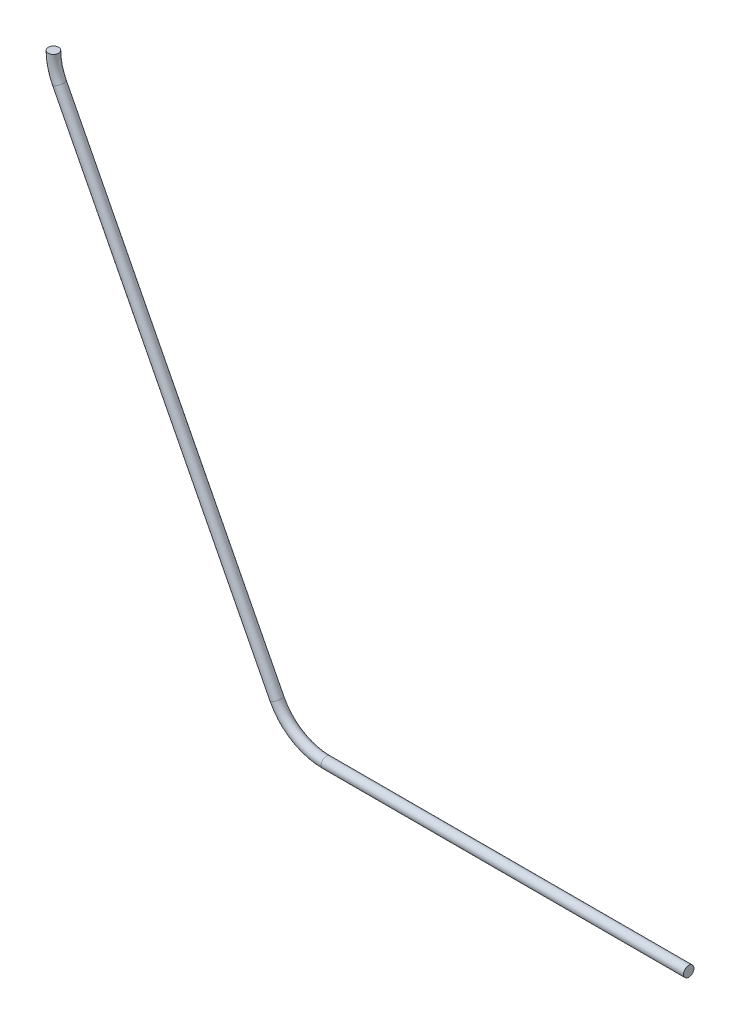
ISO-10303-21;
HEADER;
FILE_DESCRIPTION(('STEP AP214'),'2;1');
FILE_NAME('part.step','',(''),(''),'','','');
FILE_SCHEMA(('AUTOMOTIVE_DESIGN { 1 0 10303 214 1 1 1 1 }'));
ENDSEC;
DATA;
#1=APPLICATION_CONTEXT('core data for automotive mechanical design processes');
#2=APPLICATION_PROTOCOL_DEFINITION('international standard','automotive_design',2000,#1);
#3=PRODUCT_CONTEXT('',#1,'mechanical');
#4=PRODUCT('Part','Part','',(#3));
#5=PRODUCT_RELATED_PRODUCT_CATEGORY('part','',(#4));
#6=PRODUCT_DEFINITION_FORMATION('','',#4);
#7=PRODUCT_DEFINITION_CONTEXT('part definition',#1,'design');
#8=PRODUCT_DEFINITION('design','',#6,#7);
#9=PRODUCT_DEFINITION_SHAPE('','',#8);
#10=(LENGTH_UNIT() NAMED_UNIT(*) SI_UNIT(.MILLI.,.METRE.));
#11=(NAMED_UNIT(*) PLANE_ANGLE_UNIT() SI_UNIT($,.RADIAN.));
#12=(NAMED_UNIT(*) SI_UNIT($,.STERADIAN.) SOLID_ANGLE_UNIT());
#13=UNCERTAINTY_MEASURE_WITH_UNIT(LENGTH_MEASURE(1.E-05),#10,'distance_accuracy_value','');
#14=(GEOMETRIC_REPRESENTATION_CONTEXT(3) GLOBAL_UNCERTAINTY_ASSIGNED_CONTEXT((#13)) GLOBAL_UNIT_ASSIGNED_CONTEXT((#10,
#11,#12)) REPRESENTATION_CONTEXT('',''));
#15=CARTESIAN_POINT('',(0.,0.,0.));
#16=DIRECTION('',(0.,0.,1.));
#17=DIRECTION('',(1.,0.,0.));
#18=AXIS2_PLACEMENT_3D('',#15,#16,#17);
#19=CARTESIAN_POINT('',(-5.36,0.,0.));
#20=DIRECTION('',(0.,1.,0.));
#21=DIRECTION('',(0.,0.,1.));
#22=AXIS2_PLACEMENT_3D('',#19,#20,#21);
#23=PLANE('',#22);
#24=CARTESIAN_POINT('',(-5.36,0.,0.));
#25=DIRECTION('',(0.,1.,0.));
#26=DIRECTION('',(0.,0.,1.));
#27=AXIS2_PLACEMENT_3D('',#24,#25,#26);
#28=CIRCLE('',#27,0.500000000000001);
#29=CARTESIAN_POINT('',(-5.36,0.,0.500000000000001));
#30=VERTEX_POINT('',#29);
#31=EDGE_CURVE('E48',#30,#30,#28,.T.);
#32=ORIENTED_EDGE('',*,*,#31,.T.);
#33=EDGE_LOOP('',(#32));
#34=FACE_BOUND('',#33,.T.);
#35=ADVANCED_FACE('F36',(#34),#23,.T.);
#36=CARTESIAN_POINT('',(56.,-46.36,0.));
#37=DIRECTION('',(-1.,0.,0.));
#38=DIRECTION('',(0.,0.,1.));
#39=AXIS2_PLACEMENT_3D('',#36,#37,#38);
#40=PLANE('',#39);
#41=CARTESIAN_POINT('',(56.,-46.36,0.));
#42=DIRECTION('',(-1.,0.,0.));
#43=DIRECTION('',(0.,0.,1.));
#44=AXIS2_PLACEMENT_3D('',#41,#42,#43);
#45=CIRCLE('',#44,0.500000000000001);
#46=CARTESIAN_POINT('',(56.,-46.36,0.500000000000001));
#47=VERTEX_POINT('',#46);
#48=EDGE_CURVE('E11',#47,#47,#45,.T.);
#49=ORIENTED_EDGE('',*,*,#48,.F.);
#50=EDGE_LOOP('',(#49));
#51=FACE_BOUND('',#50,.T.);
#52=ADVANCED_FACE('F54',(#51),#40,.F.);
#53=CARTESIAN_POINT('',(0.,0.,0.));
#54=DIRECTION('',(0.,0.,1.));
#55=DIRECTION('',(1.,0.,0.));
#56=AXIS2_PLACEMENT_3D('',#53,#54,#55);
#57=TOROIDAL_SURFACE('',#56,5.36,0.500000000000001);
#58=CARTESIAN_POINT('',(-4.77063243564244,-2.44349466215833,0.));
#59=DIRECTION('',(-0.455875869805658,0.890043364858665,0.));
#60=DIRECTION('',(0.,0.,1.));
#61=AXIS2_PLACEMENT_3D('',#58,#59,#60);
#62=CIRCLE('',#61,0.500000000000001);
#63=CARTESIAN_POINT('',(-4.77063243564244,-2.44349466215833,0.500000000000001));
#64=VERTEX_POINT('',#63);
#65=EDGE_CURVE('E84',#64,#64,#62,.T.);
#66=ORIENTED_EDGE('',*,*,#65,.T.);
#67=EDGE_LOOP('',(#66));
#68=FACE_BOUND('',#67,.T.);
#69=ORIENTED_EDGE('',*,*,#31,.F.);
#70=EDGE_LOOP('',(#69));
#71=FACE_BOUND('',#70,.T.);
#72=ADVANCED_FACE('F56',(#68,#71),#57,.T.);
#73=CARTESIAN_POINT('',(-4.77063243564244,-2.44349466215833,0.));
#74=DIRECTION('',(0.455875869805658,-0.890043364858665,0.));
#75=DIRECTION('',(0.890043364858665,0.455875869805658,0.));
#76=AXIS2_PLACEMENT_3D('',#73,#74,#75);
#77=CYLINDRICAL_SURFACE('',#76,0.500000000000001);
#78=CARTESIAN_POINT('',(16.2293675643576,-43.4434946621583,0.));
#79=DIRECTION('',(-0.455875869805658,0.890043364858665,0.));
#80=DIRECTION('',(0.,0.,1.));
#81=AXIS2_PLACEMENT_3D('',#78,#79,#80);
#82=CIRCLE('',#81,0.500000000000001);
#83=CARTESIAN_POINT('',(15.7843458819282,-43.6714325970611,0.));
#84=VERTEX_POINT('',#83);
#85=EDGE_CURVE('E81',#84,#84,#82,.T.);
#86=ORIENTED_EDGE('',*,*,#85,.T.);
#87=EDGE_LOOP('',(#86));
#88=FACE_BOUND('',#87,.T.);
#89=ORIENTED_EDGE('',*,*,#65,.F.);
#90=EDGE_LOOP('',(#89));
#91=FACE_BOUND('',#90,.T.);
#92=ADVANCED_FACE('F61',(#88,#91),#77,.T.);
#93=CARTESIAN_POINT('',(21.,-41.,0.));
#94=DIRECTION('',(0.,0.,1.));
#95=DIRECTION('',(1.,0.,0.));
#96=AXIS2_PLACEMENT_3D('',#93,#94,#95);
#97=TOROIDAL_SURFACE('',#96,5.36,0.500000000000001);
#98=CARTESIAN_POINT('',(21.,-46.36,0.));
#99=DIRECTION('',(-1.,0.,0.));
#100=DIRECTION('',(0.,0.,1.));
#101=AXIS2_PLACEMENT_3D('',#98,#99,#100);
#102=CIRCLE('',#101,0.500000000000001);
#103=CARTESIAN_POINT('',(21.,-46.86,0.));
#104=VERTEX_POINT('',#103);
#105=EDGE_CURVE('E43',#104,#104,#102,.T.);
#106=CARTESIAN_POINT('',(21.,-41.,0.));
#107=DIRECTION('',(0.,0.,1.));
#108=DIRECTION('',(1.,0.,0.));
#109=AXIS2_PLACEMENT_3D('',#106,#107,#108);
#110=CIRCLE('',#109,5.86);
#111=EDGE_CURVE('',#84,#104,#110,.T.);
#112=ORIENTED_EDGE('',*,*,#85,.F.);
#113=ORIENTED_EDGE('',*,*,#105,.T.);
#114=ORIENTED_EDGE('',*,*,#111,.T.);
#115=ORIENTED_EDGE('',*,*,#111,.F.);
#116=EDGE_LOOP('',(#112,#114,#113,#115));
#117=FACE_BOUND('',#116,.T.);
#118=ADVANCED_FACE('F67',(#117),#97,.T.);
#119=CARTESIAN_POINT('',(21.,-46.36,0.));
#120=DIRECTION('',(1.,0.,0.));
#121=DIRECTION('',(0.,1.,0.));
#122=AXIS2_PLACEMENT_3D('',#119,#120,#121);
#123=CYLINDRICAL_SURFACE('',#122,0.500000000000001);
#124=ORIENTED_EDGE('',*,*,#48,.T.);
#125=EDGE_LOOP('',(#124));
#126=FACE_BOUND('',#125,.T.);
#127=ORIENTED_EDGE('',*,*,#105,.F.);
#128=EDGE_LOOP('',(#127));
#129=FACE_BOUND('',#128,.T.);
#130=ADVANCED_FACE('F51',(#126,#129),#123,.T.);
#131=CLOSED_SHELL('',(#35,#52,#72,#92,#118,#130));
#132=MANIFOLD_SOLID_BREP('B2',#131);
#133=ADVANCED_BREP_SHAPE_REPRESENTATION('',(#18,#132),#14);
#134=SHAPE_DEFINITION_REPRESENTATION(#9,#133);
ENDSEC;
END-ISO-10303-21;
